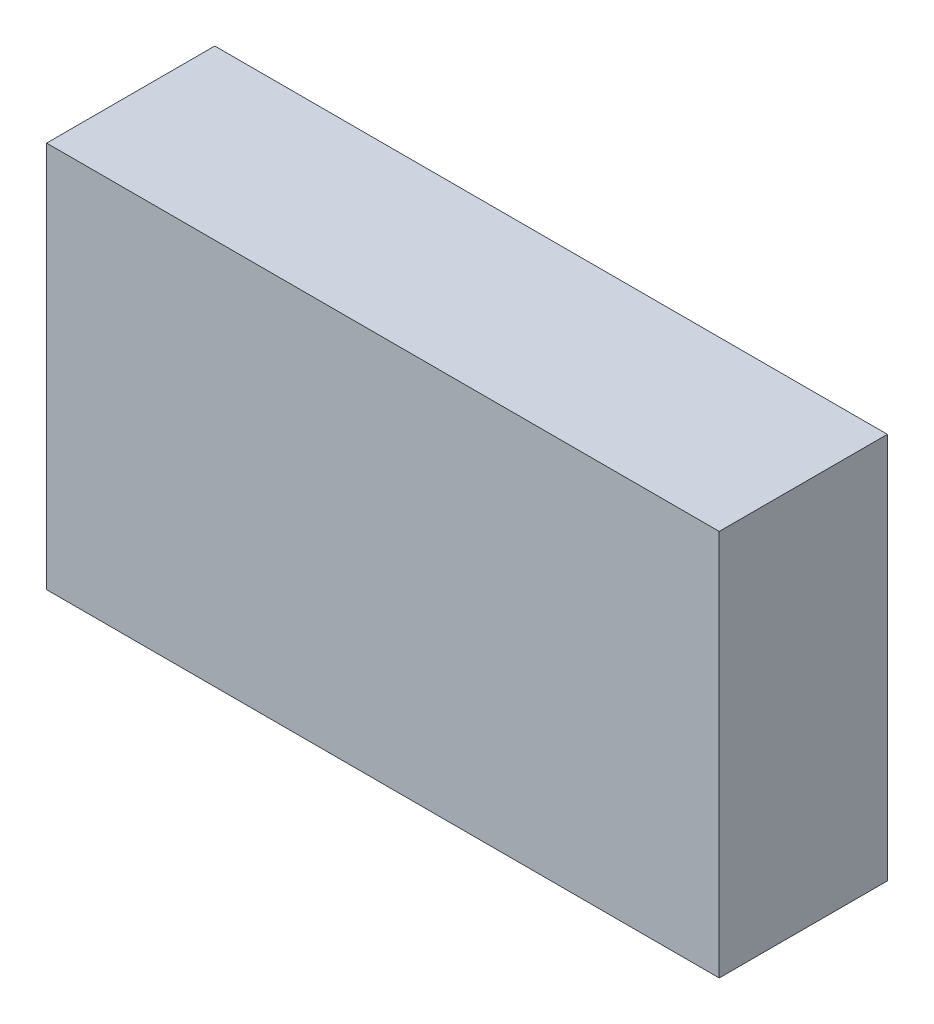
ISO-10303-21;
HEADER;
FILE_DESCRIPTION(('STEP AP214'),'2;1');
FILE_NAME('part.step','',(''),(''),'','','');
FILE_SCHEMA(('AUTOMOTIVE_DESIGN { 1 0 10303 214 1 1 1 1 }'));
ENDSEC;
DATA;
#1=APPLICATION_CONTEXT('core data for automotive mechanical design processes');
#2=APPLICATION_PROTOCOL_DEFINITION('international standard','automotive_design',2000,#1);
#3=PRODUCT_CONTEXT('',#1,'mechanical');
#4=PRODUCT('Part','Part','',(#3));
#5=PRODUCT_RELATED_PRODUCT_CATEGORY('part','',(#4));
#6=PRODUCT_DEFINITION_FORMATION('','',#4);
#7=PRODUCT_DEFINITION_CONTEXT('part definition',#1,'design');
#8=PRODUCT_DEFINITION('design','',#6,#7);
#9=PRODUCT_DEFINITION_SHAPE('','',#8);
#10=(LENGTH_UNIT() NAMED_UNIT(*) SI_UNIT(.MILLI.,.METRE.));
#11=(NAMED_UNIT(*) PLANE_ANGLE_UNIT() SI_UNIT($,.RADIAN.));
#12=(NAMED_UNIT(*) SI_UNIT($,.STERADIAN.) SOLID_ANGLE_UNIT());
#13=UNCERTAINTY_MEASURE_WITH_UNIT(LENGTH_MEASURE(1.E-05),#10,'distance_accuracy_value','');
#14=(GEOMETRIC_REPRESENTATION_CONTEXT(3) GLOBAL_UNCERTAINTY_ASSIGNED_CONTEXT((#13)) GLOBAL_UNIT_ASSIGNED_CONTEXT((#10,
#11,#12)) REPRESENTATION_CONTEXT('',''));
#15=CARTESIAN_POINT('',(0.,0.,0.));
#16=DIRECTION('',(0.,0.,1.));
#17=DIRECTION('',(1.,0.,0.));
#18=AXIS2_PLACEMENT_3D('',#15,#16,#17);
#19=CARTESIAN_POINT('',(0.,0.,10.));
#20=DIRECTION('',(1.,0.,0.));
#21=DIRECTION('',(0.,0.,-1.));
#22=AXIS2_PLACEMENT_3D('',#19,#20,#21);
#23=PLANE('',#22);
#24=DIRECTION('',(0.,-1.,0.));
#25=VECTOR('',#24,1.);
#26=CARTESIAN_POINT('',(0.,0.,0.));
#27=LINE('',#26,#25);
#28=CARTESIAN_POINT('',(0.,23.,0.));
#29=VERTEX_POINT('',#28);
#30=CARTESIAN_POINT('',(0.,0.,0.));
#31=VERTEX_POINT('',#30);
#32=EDGE_CURVE('E106',#29,#31,#27,.T.);
#33=ORIENTED_EDGE('',*,*,#32,.T.);
#34=DIRECTION('',(0.,0.,-1.));
#35=VECTOR('',#34,1.);
#36=CARTESIAN_POINT('',(0.,0.,10.));
#37=LINE('',#36,#35);
#38=CARTESIAN_POINT('',(0.,0.,10.));
#39=VERTEX_POINT('',#38);
#40=EDGE_CURVE('E11',#39,#31,#37,.T.);
#41=ORIENTED_EDGE('',*,*,#40,.F.);
#42=DIRECTION('',(0.,-1.,0.));
#43=VECTOR('',#42,1.);
#44=CARTESIAN_POINT('',(0.,0.,10.));
#45=LINE('',#44,#43);
#46=CARTESIAN_POINT('',(0.,23.,10.));
#47=VERTEX_POINT('',#46);
#48=EDGE_CURVE('E94',#47,#39,#45,.T.);
#49=ORIENTED_EDGE('',*,*,#48,.F.);
#50=DIRECTION('',(0.,0.,-1.));
#51=VECTOR('',#50,1.);
#52=CARTESIAN_POINT('',(0.,23.,10.));
#53=LINE('',#52,#51);
#54=EDGE_CURVE('E105',#47,#29,#53,.T.);
#55=ORIENTED_EDGE('',*,*,#54,.T.);
#56=EDGE_LOOP('',(#33,#41,#49,#55));
#57=FACE_BOUND('',#56,.T.);
#58=ADVANCED_FACE('F43',(#57),#23,.F.);
#59=CARTESIAN_POINT('',(0.,0.,10.));
#60=DIRECTION('',(0.,1.,0.));
#61=DIRECTION('',(0.,0.,1.));
#62=AXIS2_PLACEMENT_3D('',#59,#60,#61);
#63=PLANE('',#62);
#64=DIRECTION('',(1.,0.,0.));
#65=VECTOR('',#64,1.);
#66=CARTESIAN_POINT('',(0.,0.,0.));
#67=LINE('',#66,#65);
#68=CARTESIAN_POINT('',(40.,0.,0.));
#69=VERTEX_POINT('',#68);
#70=EDGE_CURVE('E98',#31,#69,#67,.T.);
#71=ORIENTED_EDGE('',*,*,#70,.T.);
#72=DIRECTION('',(0.,0.,-1.));
#73=VECTOR('',#72,1.);
#74=CARTESIAN_POINT('',(40.,0.,10.));
#75=LINE('',#74,#73);
#76=CARTESIAN_POINT('',(40.,0.,10.));
#77=VERTEX_POINT('',#76);
#78=EDGE_CURVE('E51',#77,#69,#75,.T.);
#79=ORIENTED_EDGE('',*,*,#78,.F.);
#80=DIRECTION('',(1.,0.,0.));
#81=VECTOR('',#80,1.);
#82=CARTESIAN_POINT('',(0.,0.,10.));
#83=LINE('',#82,#81);
#84=EDGE_CURVE('E90',#39,#77,#83,.T.);
#85=ORIENTED_EDGE('',*,*,#84,.F.);
#86=ORIENTED_EDGE('',*,*,#40,.T.);
#87=EDGE_LOOP('',(#71,#79,#85,#86));
#88=FACE_BOUND('',#87,.T.);
#89=ADVANCED_FACE('F100',(#88),#63,.F.);
#90=CARTESIAN_POINT('',(40.,0.,10.));
#91=DIRECTION('',(-1.,0.,0.));
#92=DIRECTION('',(0.,0.,1.));
#93=AXIS2_PLACEMENT_3D('',#90,#91,#92);
#94=PLANE('',#93);
#95=DIRECTION('',(0.,1.,0.));
#96=VECTOR('',#95,1.);
#97=CARTESIAN_POINT('',(40.,0.,0.));
#98=LINE('',#97,#96);
#99=CARTESIAN_POINT('',(40.,23.,0.));
#100=VERTEX_POINT('',#99);
#101=EDGE_CURVE('E77',#69,#100,#98,.T.);
#102=ORIENTED_EDGE('',*,*,#101,.T.);
#103=DIRECTION('',(0.,0.,-1.));
#104=VECTOR('',#103,1.);
#105=CARTESIAN_POINT('',(40.,23.,10.));
#106=LINE('',#105,#104);
#107=CARTESIAN_POINT('',(40.,23.,10.));
#108=VERTEX_POINT('',#107);
#109=EDGE_CURVE('E97',#108,#100,#106,.T.);
#110=ORIENTED_EDGE('',*,*,#109,.F.);
#111=DIRECTION('',(0.,1.,0.));
#112=VECTOR('',#111,1.);
#113=CARTESIAN_POINT('',(40.,0.,10.));
#114=LINE('',#113,#112);
#115=EDGE_CURVE('E95',#77,#108,#114,.T.);
#116=ORIENTED_EDGE('',*,*,#115,.F.);
#117=ORIENTED_EDGE('',*,*,#78,.T.);
#118=EDGE_LOOP('',(#102,#110,#116,#117));
#119=FACE_BOUND('',#118,.T.);
#120=ADVANCED_FACE('F99',(#119),#94,.F.);
#121=CARTESIAN_POINT('',(0.,23.,10.));
#122=DIRECTION('',(0.,-1.,0.));
#123=DIRECTION('',(0.,0.,-1.));
#124=AXIS2_PLACEMENT_3D('',#121,#122,#123);
#125=PLANE('',#124);
#126=DIRECTION('',(-1.,0.,0.));
#127=VECTOR('',#126,1.);
#128=CARTESIAN_POINT('',(0.,23.,0.));
#129=LINE('',#128,#127);
#130=EDGE_CURVE('E82',#100,#29,#129,.T.);
#131=ORIENTED_EDGE('',*,*,#130,.T.);
#132=ORIENTED_EDGE('',*,*,#54,.F.);
#133=DIRECTION('',(-1.,0.,0.));
#134=VECTOR('',#133,1.);
#135=CARTESIAN_POINT('',(0.,23.,10.));
#136=LINE('',#135,#134);
#137=EDGE_CURVE('E56',#108,#47,#136,.T.);
#138=ORIENTED_EDGE('',*,*,#137,.F.);
#139=ORIENTED_EDGE('',*,*,#109,.T.);
#140=EDGE_LOOP('',(#131,#132,#138,#139));
#141=FACE_BOUND('',#140,.T.);
#142=ADVANCED_FACE('F114',(#141),#125,.F.);
#143=CARTESIAN_POINT('',(0.,0.,10.));
#144=DIRECTION('',(0.,0.,-1.));
#145=DIRECTION('',(-1.,0.,0.));
#146=AXIS2_PLACEMENT_3D('',#143,#144,#145);
#147=PLANE('',#146);
#148=ORIENTED_EDGE('',*,*,#48,.T.);
#149=ORIENTED_EDGE('',*,*,#84,.T.);
#150=ORIENTED_EDGE('',*,*,#115,.T.);
#151=ORIENTED_EDGE('',*,*,#137,.T.);
#152=EDGE_LOOP('',(#148,#149,#150,#151));
#153=FACE_BOUND('',#152,.T.);
#154=ADVANCED_FACE('F89',(#153),#147,.F.);
#155=CARTESIAN_POINT('',(0.,0.,0.));
#156=DIRECTION('',(0.,0.,-1.));
#157=DIRECTION('',(-1.,0.,0.));
#158=AXIS2_PLACEMENT_3D('',#155,#156,#157);
#159=PLANE('',#158);
#160=ORIENTED_EDGE('',*,*,#32,.F.);
#161=ORIENTED_EDGE('',*,*,#130,.F.);
#162=ORIENTED_EDGE('',*,*,#101,.F.);
#163=ORIENTED_EDGE('',*,*,#70,.F.);
#164=EDGE_LOOP('',(#160,#161,#162,#163));
#165=FACE_BOUND('',#164,.T.);
#166=ADVANCED_FACE('F117',(#165),#159,.T.);
#167=CLOSED_SHELL('',(#58,#89,#120,#142,#154,#166));
#168=MANIFOLD_SOLID_BREP('B2',#167);
#169=ADVANCED_BREP_SHAPE_REPRESENTATION('',(#18,#168),#14);
#170=SHAPE_DEFINITION_REPRESENTATION(#9,#169);
ENDSEC;
END-ISO-10303-21;
